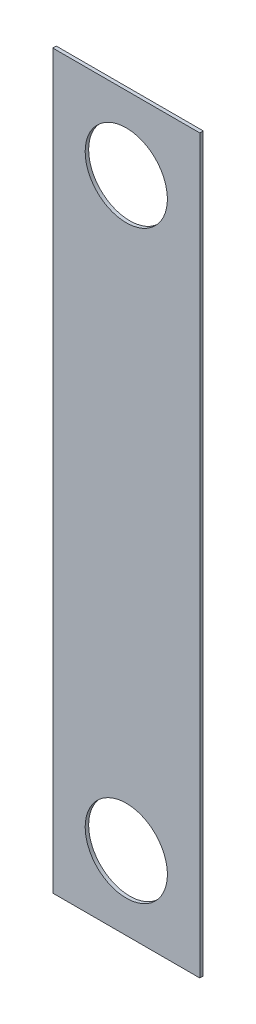
ISO-10303-21;
HEADER;
FILE_DESCRIPTION(('STEP AP214'),'2;1');
FILE_NAME('part.step','',(''),(''),'','','');
FILE_SCHEMA(('AUTOMOTIVE_DESIGN { 1 0 10303 214 1 1 1 1 }'));
ENDSEC;
DATA;
#1=APPLICATION_CONTEXT('core data for automotive mechanical design processes');
#2=APPLICATION_PROTOCOL_DEFINITION('international standard','automotive_design',2000,#1);
#3=PRODUCT_CONTEXT('',#1,'mechanical');
#4=PRODUCT('Part','Part','',(#3));
#5=PRODUCT_RELATED_PRODUCT_CATEGORY('part','',(#4));
#6=PRODUCT_DEFINITION_FORMATION('','',#4);
#7=PRODUCT_DEFINITION_CONTEXT('part definition',#1,'design');
#8=PRODUCT_DEFINITION('design','',#6,#7);
#9=PRODUCT_DEFINITION_SHAPE('','',#8);
#10=(LENGTH_UNIT() NAMED_UNIT(*) SI_UNIT(.MILLI.,.METRE.));
#11=(NAMED_UNIT(*) PLANE_ANGLE_UNIT() SI_UNIT($,.RADIAN.));
#12=(NAMED_UNIT(*) SI_UNIT($,.STERADIAN.) SOLID_ANGLE_UNIT());
#13=UNCERTAINTY_MEASURE_WITH_UNIT(LENGTH_MEASURE(1.E-05),#10,'distance_accuracy_value','');
#14=(GEOMETRIC_REPRESENTATION_CONTEXT(3) GLOBAL_UNCERTAINTY_ASSIGNED_CONTEXT((#13)) GLOBAL_UNIT_ASSIGNED_CONTEXT((#10,
#11,#12)) REPRESENTATION_CONTEXT('',''));
#15=CARTESIAN_POINT('',(0.,0.,0.));
#16=DIRECTION('',(0.,0.,1.));
#17=DIRECTION('',(1.,0.,0.));
#18=AXIS2_PLACEMENT_3D('',#15,#16,#17);
#19=CARTESIAN_POINT('',(0.,0.,0.));
#20=DIRECTION('',(0.,0.,-1.));
#21=DIRECTION('',(-1.,0.,0.));
#22=AXIS2_PLACEMENT_3D('',#19,#20,#21);
#23=PLANE('',#22);
#24=CARTESIAN_POINT('',(6.34999999999999,56.87,0.));
#25=DIRECTION('',(0.,0.,-1.));
#26=DIRECTION('',(-1.,0.,0.));
#27=AXIS2_PLACEMENT_3D('',#24,#25,#26);
#28=CIRCLE('',#27,3.55);
#29=CARTESIAN_POINT('',(2.79999999999999,56.87,0.));
#30=VERTEX_POINT('',#29);
#31=EDGE_CURVE('E82',#30,#30,#28,.F.);
#32=ORIENTED_EDGE('',*,*,#31,.T.);
#33=EDGE_LOOP('',(#32));
#34=FACE_BOUND('',#33,.T.);
#35=CARTESIAN_POINT('',(6.35,6.35,0.));
#36=DIRECTION('',(0.,0.,-1.));
#37=DIRECTION('',(-1.,0.,0.));
#38=AXIS2_PLACEMENT_3D('',#35,#36,#37);
#39=CIRCLE('',#38,3.55);
#40=CARTESIAN_POINT('',(2.8,6.35,0.));
#41=VERTEX_POINT('',#40);
#42=EDGE_CURVE('E20',#41,#41,#39,.F.);
#43=ORIENTED_EDGE('',*,*,#42,.T.);
#44=EDGE_LOOP('',(#43));
#45=FACE_BOUND('',#44,.T.);
#46=DIRECTION('',(0.,-1.,0.));
#47=VECTOR('',#46,1.);
#48=CARTESIAN_POINT('',(12.7,0.,0.));
#49=LINE('',#48,#47);
#50=CARTESIAN_POINT('',(12.7,63.22,0.));
#51=VERTEX_POINT('',#50);
#52=CARTESIAN_POINT('',(12.7,0.,0.));
#53=VERTEX_POINT('',#52);
#54=EDGE_CURVE('E56',#51,#53,#49,.T.);
#55=ORIENTED_EDGE('',*,*,#54,.T.);
#56=DIRECTION('',(-1.,0.,0.));
#57=VECTOR('',#56,1.);
#58=CARTESIAN_POINT('',(0.,0.,0.));
#59=LINE('',#58,#57);
#60=CARTESIAN_POINT('',(0.,0.,0.));
#61=VERTEX_POINT('',#60);
#62=EDGE_CURVE('E97',#53,#61,#59,.T.);
#63=ORIENTED_EDGE('',*,*,#62,.T.);
#64=DIRECTION('',(0.,1.,0.));
#65=VECTOR('',#64,1.);
#66=CARTESIAN_POINT('',(0.,0.,0.));
#67=LINE('',#66,#65);
#68=CARTESIAN_POINT('',(0.,63.22,0.));
#69=VERTEX_POINT('',#68);
#70=EDGE_CURVE('E60',#61,#69,#67,.T.);
#71=ORIENTED_EDGE('',*,*,#70,.T.);
#72=DIRECTION('',(1.,0.,0.));
#73=VECTOR('',#72,1.);
#74=CARTESIAN_POINT('',(0.,63.22,0.));
#75=LINE('',#74,#73);
#76=EDGE_CURVE('E59',#69,#51,#75,.T.);
#77=ORIENTED_EDGE('',*,*,#76,.T.);
#78=EDGE_LOOP('',(#55,#63,#71,#77));
#79=FACE_BOUND('',#78,.T.);
#80=ADVANCED_FACE('F17',(#34,#45,#79),#23,.T.);
#81=CARTESIAN_POINT('',(0.,63.22,0.3));
#82=DIRECTION('',(0.,-1.,0.));
#83=DIRECTION('',(0.,0.,-1.));
#84=AXIS2_PLACEMENT_3D('',#81,#82,#83);
#85=PLANE('',#84);
#86=DIRECTION('',(0.,0.,-1.));
#87=VECTOR('',#86,1.);
#88=CARTESIAN_POINT('',(0.,63.22,0.3));
#89=LINE('',#88,#87);
#90=CARTESIAN_POINT('',(0.,63.22,0.3));
#91=VERTEX_POINT('',#90);
#92=EDGE_CURVE('E92',#69,#91,#89,.F.);
#93=ORIENTED_EDGE('',*,*,#92,.T.);
#94=DIRECTION('',(-1.,0.,0.));
#95=VECTOR('',#94,1.);
#96=CARTESIAN_POINT('',(0.,63.22,0.3));
#97=LINE('',#96,#95);
#98=CARTESIAN_POINT('',(12.7,63.22,0.3));
#99=VERTEX_POINT('',#98);
#100=EDGE_CURVE('E76',#91,#99,#97,.F.);
#101=ORIENTED_EDGE('',*,*,#100,.T.);
#102=DIRECTION('',(0.,0.,1.));
#103=VECTOR('',#102,1.);
#104=CARTESIAN_POINT('',(12.7,63.22,0.3));
#105=LINE('',#104,#103);
#106=EDGE_CURVE('E65',#99,#51,#105,.F.);
#107=ORIENTED_EDGE('',*,*,#106,.T.);
#108=ORIENTED_EDGE('',*,*,#76,.F.);
#109=EDGE_LOOP('',(#93,#101,#107,#108));
#110=FACE_BOUND('',#109,.T.);
#111=ADVANCED_FACE('F75',(#110),#85,.F.);
#112=CARTESIAN_POINT('',(12.7,0.,0.3));
#113=DIRECTION('',(-1.,0.,0.));
#114=DIRECTION('',(0.,-1.,0.));
#115=AXIS2_PLACEMENT_3D('',#112,#113,#114);
#116=PLANE('',#115);
#117=ORIENTED_EDGE('',*,*,#106,.F.);
#118=DIRECTION('',(0.,1.,0.));
#119=VECTOR('',#118,1.);
#120=CARTESIAN_POINT('',(12.7,0.,0.3));
#121=LINE('',#120,#119);
#122=CARTESIAN_POINT('',(12.7,0.,0.3));
#123=VERTEX_POINT('',#122);
#124=EDGE_CURVE('E86',#99,#123,#121,.F.);
#125=ORIENTED_EDGE('',*,*,#124,.T.);
#126=DIRECTION('',(0.,0.,1.));
#127=VECTOR('',#126,1.);
#128=CARTESIAN_POINT('',(12.7,0.,0.3));
#129=LINE('',#128,#127);
#130=EDGE_CURVE('E72',#123,#53,#129,.F.);
#131=ORIENTED_EDGE('',*,*,#130,.T.);
#132=ORIENTED_EDGE('',*,*,#54,.F.);
#133=EDGE_LOOP('',(#117,#125,#131,#132));
#134=FACE_BOUND('',#133,.T.);
#135=ADVANCED_FACE('F69',(#134),#116,.F.);
#136=CARTESIAN_POINT('',(0.,0.,0.3));
#137=DIRECTION('',(0.,1.,0.));
#138=DIRECTION('',(-1.,0.,0.));
#139=AXIS2_PLACEMENT_3D('',#136,#137,#138);
#140=PLANE('',#139);
#141=ORIENTED_EDGE('',*,*,#130,.F.);
#142=DIRECTION('',(-1.,0.,0.));
#143=VECTOR('',#142,1.);
#144=CARTESIAN_POINT('',(0.,0.,0.3));
#145=LINE('',#144,#143);
#146=CARTESIAN_POINT('',(0.,0.,0.3));
#147=VERTEX_POINT('',#146);
#148=EDGE_CURVE('E103',#123,#147,#145,.T.);
#149=ORIENTED_EDGE('',*,*,#148,.T.);
#150=DIRECTION('',(0.,0.,-1.));
#151=VECTOR('',#150,1.);
#152=CARTESIAN_POINT('',(0.,0.,0.3));
#153=LINE('',#152,#151);
#154=EDGE_CURVE('E35',#147,#61,#153,.T.);
#155=ORIENTED_EDGE('',*,*,#154,.T.);
#156=ORIENTED_EDGE('',*,*,#62,.F.);
#157=EDGE_LOOP('',(#141,#149,#155,#156));
#158=FACE_BOUND('',#157,.T.);
#159=ADVANCED_FACE('F101',(#158),#140,.F.);
#160=CARTESIAN_POINT('',(0.,0.,0.3));
#161=DIRECTION('',(1.,0.,0.));
#162=DIRECTION('',(0.,0.,-1.));
#163=AXIS2_PLACEMENT_3D('',#160,#161,#162);
#164=PLANE('',#163);
#165=ORIENTED_EDGE('',*,*,#154,.F.);
#166=DIRECTION('',(0.,1.,0.));
#167=VECTOR('',#166,1.);
#168=CARTESIAN_POINT('',(0.,0.,0.3));
#169=LINE('',#168,#167);
#170=EDGE_CURVE('E81',#147,#91,#169,.T.);
#171=ORIENTED_EDGE('',*,*,#170,.T.);
#172=ORIENTED_EDGE('',*,*,#92,.F.);
#173=ORIENTED_EDGE('',*,*,#70,.F.);
#174=EDGE_LOOP('',(#165,#171,#172,#173));
#175=FACE_BOUND('',#174,.T.);
#176=ADVANCED_FACE('F99',(#175),#164,.F.);
#177=CARTESIAN_POINT('',(6.35,6.35,0.3));
#178=DIRECTION('',(0.,0.,-1.));
#179=DIRECTION('',(-1.,0.,0.));
#180=AXIS2_PLACEMENT_3D('',#177,#178,#179);
#181=CYLINDRICAL_SURFACE('',#180,3.55);
#182=ORIENTED_EDGE('',*,*,#42,.F.);
#183=EDGE_LOOP('',(#182));
#184=FACE_BOUND('',#183,.T.);
#185=CARTESIAN_POINT('',(6.35,6.35,0.3));
#186=DIRECTION('',(0.,0.,-1.));
#187=DIRECTION('',(-1.,0.,0.));
#188=AXIS2_PLACEMENT_3D('',#185,#186,#187);
#189=CIRCLE('',#188,3.55);
#190=CARTESIAN_POINT('',(2.8,6.35,0.3));
#191=VERTEX_POINT('',#190);
#192=EDGE_CURVE('E26',#191,#191,#189,.F.);
#193=ORIENTED_EDGE('',*,*,#192,.T.);
#194=EDGE_LOOP('',(#193));
#195=FACE_BOUND('',#194,.T.);
#196=ADVANCED_FACE('F116',(#184,#195),#181,.F.);
#197=CARTESIAN_POINT('',(6.34999999999999,56.87,0.3));
#198=DIRECTION('',(0.,0.,-1.));
#199=DIRECTION('',(-1.,0.,0.));
#200=AXIS2_PLACEMENT_3D('',#197,#198,#199);
#201=CYLINDRICAL_SURFACE('',#200,3.55);
#202=ORIENTED_EDGE('',*,*,#31,.F.);
#203=EDGE_LOOP('',(#202));
#204=FACE_BOUND('',#203,.T.);
#205=CARTESIAN_POINT('',(6.34999999999999,56.87,0.3));
#206=DIRECTION('',(0.,0.,-1.));
#207=DIRECTION('',(-1.,0.,0.));
#208=AXIS2_PLACEMENT_3D('',#205,#206,#207);
#209=CIRCLE('',#208,3.55);
#210=CARTESIAN_POINT('',(2.79999999999999,56.87,0.3));
#211=VERTEX_POINT('',#210);
#212=EDGE_CURVE('E11',#211,#211,#209,.F.);
#213=ORIENTED_EDGE('',*,*,#212,.T.);
#214=EDGE_LOOP('',(#213));
#215=FACE_BOUND('',#214,.T.);
#216=ADVANCED_FACE('F109',(#204,#215),#201,.F.);
#217=CARTESIAN_POINT('',(0.,0.,0.3));
#218=DIRECTION('',(0.,0.,-1.));
#219=DIRECTION('',(-1.,0.,0.));
#220=AXIS2_PLACEMENT_3D('',#217,#218,#219);
#221=PLANE('',#220);
#222=ORIENTED_EDGE('',*,*,#212,.F.);
#223=EDGE_LOOP('',(#222));
#224=FACE_BOUND('',#223,.T.);
#225=ORIENTED_EDGE('',*,*,#192,.F.);
#226=EDGE_LOOP('',(#225));
#227=FACE_BOUND('',#226,.T.);
#228=ORIENTED_EDGE('',*,*,#148,.F.);
#229=ORIENTED_EDGE('',*,*,#124,.F.);
#230=ORIENTED_EDGE('',*,*,#100,.F.);
#231=ORIENTED_EDGE('',*,*,#170,.F.);
#232=EDGE_LOOP('',(#228,#229,#230,#231));
#233=FACE_BOUND('',#232,.T.);
#234=ADVANCED_FACE('F107',(#224,#227,#233),#221,.F.);
#235=CLOSED_SHELL('',(#80,#111,#135,#159,#176,#196,#216,#234));
#236=MANIFOLD_SOLID_BREP('B1',#235);
#237=ADVANCED_BREP_SHAPE_REPRESENTATION('',(#18,#236),#14);
#238=SHAPE_DEFINITION_REPRESENTATION(#9,#237);
ENDSEC;
END-ISO-10303-21;
